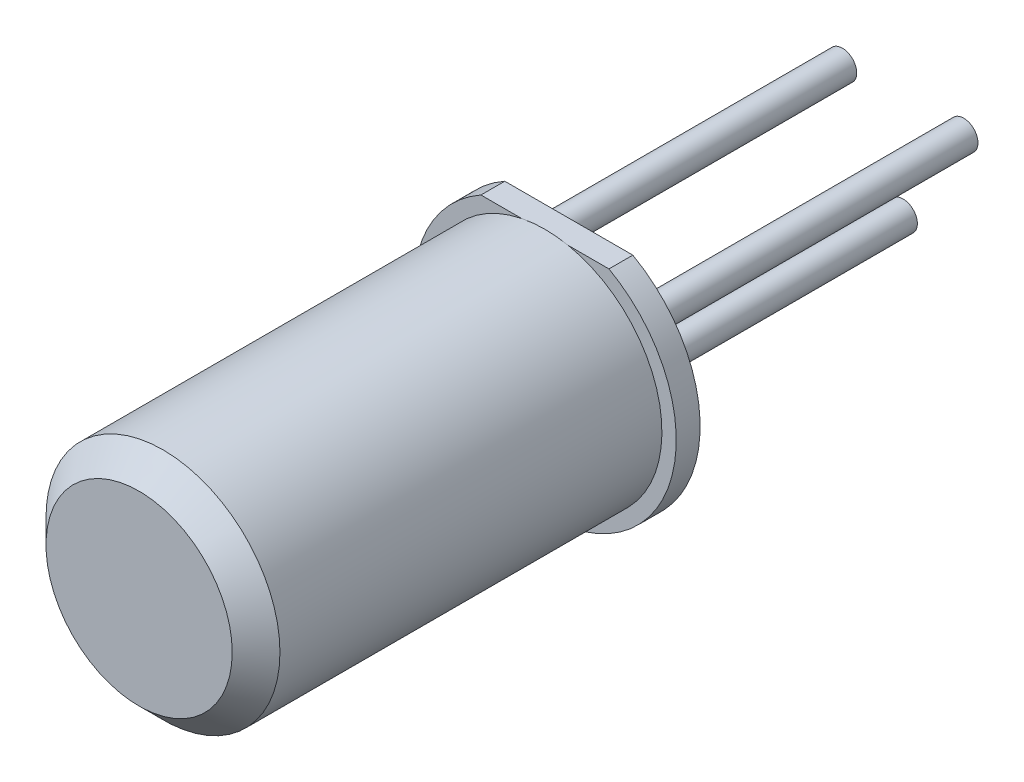
ISO-10303-21;
HEADER;
FILE_DESCRIPTION(('STEP AP214'),'2;1');
FILE_NAME('part.step','',(''),(''),'','','');
FILE_SCHEMA(('AUTOMOTIVE_DESIGN { 1 0 10303 214 1 1 1 1 }'));
ENDSEC;
DATA;
#1=APPLICATION_CONTEXT('core data for automotive mechanical design processes');
#2=APPLICATION_PROTOCOL_DEFINITION('international standard','automotive_design',2000,#1);
#3=PRODUCT_CONTEXT('',#1,'mechanical');
#4=PRODUCT('Part','Part','',(#3));
#5=PRODUCT_RELATED_PRODUCT_CATEGORY('part','',(#4));
#6=PRODUCT_DEFINITION_FORMATION('','',#4);
#7=PRODUCT_DEFINITION_CONTEXT('part definition',#1,'design');
#8=PRODUCT_DEFINITION('design','',#6,#7);
#9=PRODUCT_DEFINITION_SHAPE('','',#8);
#10=(LENGTH_UNIT() NAMED_UNIT(*) SI_UNIT(.MILLI.,.METRE.));
#11=(NAMED_UNIT(*) PLANE_ANGLE_UNIT() SI_UNIT($,.RADIAN.));
#12=(NAMED_UNIT(*) SI_UNIT($,.STERADIAN.) SOLID_ANGLE_UNIT());
#13=UNCERTAINTY_MEASURE_WITH_UNIT(LENGTH_MEASURE(1.E-05),#10,'distance_accuracy_value','');
#14=(GEOMETRIC_REPRESENTATION_CONTEXT(3) GLOBAL_UNCERTAINTY_ASSIGNED_CONTEXT((#13)) GLOBAL_UNIT_ASSIGNED_CONTEXT((#10,
#11,#12)) REPRESENTATION_CONTEXT('',''));
#15=CARTESIAN_POINT('',(0.,0.,0.));
#16=DIRECTION('',(0.,0.,1.));
#17=DIRECTION('',(1.,0.,0.));
#18=AXIS2_PLACEMENT_3D('',#15,#16,#17);
#19=CARTESIAN_POINT('',(0.,0.,7.));
#20=DIRECTION('',(0.,0.,1.));
#21=DIRECTION('',(1.,0.,0.));
#22=AXIS2_PLACEMENT_3D('',#19,#20,#21);
#23=PLANE('',#22);
#24=CARTESIAN_POINT('',(1.27,1.05,7.));
#25=DIRECTION('',(0.,0.,1.));
#26=DIRECTION('',(1.,0.,0.));
#27=AXIS2_PLACEMENT_3D('',#24,#25,#26);
#28=CIRCLE('',#27,0.300000000000004);
#29=CARTESIAN_POINT('',(1.57,1.05,7.));
#30=VERTEX_POINT('',#29);
#31=EDGE_CURVE('E95',#30,#30,#28,.F.);
#32=ORIENTED_EDGE('',*,*,#31,.F.);
#33=EDGE_LOOP('',(#32));
#34=FACE_BOUND('',#33,.T.);
#35=CARTESIAN_POINT('',(0.,0.,7.));
#36=DIRECTION('',(0.,0.,1.));
#37=DIRECTION('',(1.,0.,0.));
#38=AXIS2_PLACEMENT_3D('',#35,#36,#37);
#39=CIRCLE('',#38,2.75);
#40=CARTESIAN_POINT('',(-1.34079252995773,2.40099466713476,7.));
#41=VERTEX_POINT('',#40);
#42=CARTESIAN_POINT('',(1.34079252995773,2.40099466713476,7.));
#43=VERTEX_POINT('',#42);
#44=EDGE_CURVE('E75',#41,#43,#39,.T.);
#45=ORIENTED_EDGE('',*,*,#44,.F.);
#46=DIRECTION('',(-1.,0.,0.));
#47=VECTOR('',#46,1.);
#48=CARTESIAN_POINT('',(-1.34079252995773,2.40099466713476,7.));
#49=LINE('',#48,#47);
#50=EDGE_CURVE('E64',#43,#41,#49,.T.);
#51=ORIENTED_EDGE('',*,*,#50,.F.);
#52=EDGE_LOOP('',(#45,#51));
#53=FACE_BOUND('',#52,.T.);
#54=CARTESIAN_POINT('',(-1.27,1.05,7.));
#55=DIRECTION('',(0.,0.,1.));
#56=DIRECTION('',(1.,0.,0.));
#57=AXIS2_PLACEMENT_3D('',#54,#55,#56);
#58=CIRCLE('',#57,0.300000000000001);
#59=CARTESIAN_POINT('',(-0.969999999999999,1.05,7.));
#60=VERTEX_POINT('',#59);
#61=EDGE_CURVE('E92',#60,#60,#58,.T.);
#62=ORIENTED_EDGE('',*,*,#61,.T.);
#63=EDGE_LOOP('',(#62));
#64=FACE_BOUND('',#63,.T.);
#65=CARTESIAN_POINT('',(0.,-1.05,7.));
#66=DIRECTION('',(0.,0.,1.));
#67=DIRECTION('',(1.,0.,0.));
#68=AXIS2_PLACEMENT_3D('',#65,#66,#67);
#69=CIRCLE('',#68,0.300000000000001);
#70=CARTESIAN_POINT('',(0.300000000000001,-1.05,7.));
#71=VERTEX_POINT('',#70);
#72=EDGE_CURVE('E100',#71,#71,#69,.F.);
#73=ORIENTED_EDGE('',*,*,#72,.F.);
#74=EDGE_LOOP('',(#73));
#75=FACE_BOUND('',#74,.T.);
#76=ADVANCED_FACE('F31',(#34,#53,#64,#75),#23,.F.);
#77=CARTESIAN_POINT('',(-1.27,1.05,7.));
#78=DIRECTION('',(0.,0.,-1.));
#79=DIRECTION('',(-1.,0.,0.));
#80=AXIS2_PLACEMENT_3D('',#77,#78,#79);
#81=CYLINDRICAL_SURFACE('',#80,0.300000000000001);
#82=ORIENTED_EDGE('',*,*,#61,.F.);
#83=EDGE_LOOP('',(#82));
#84=FACE_BOUND('',#83,.T.);
#85=CARTESIAN_POINT('',(-1.27,1.05,0.));
#86=DIRECTION('',(0.,0.,1.));
#87=DIRECTION('',(1.,0.,0.));
#88=AXIS2_PLACEMENT_3D('',#85,#86,#87);
#89=CIRCLE('',#88,0.300000000000001);
#90=CARTESIAN_POINT('',(-0.969999999999999,1.05,0.));
#91=VERTEX_POINT('',#90);
#92=EDGE_CURVE('E91',#91,#91,#89,.T.);
#93=ORIENTED_EDGE('',*,*,#92,.T.);
#94=EDGE_LOOP('',(#93));
#95=FACE_BOUND('',#94,.T.);
#96=ADVANCED_FACE('F136',(#84,#95),#81,.T.);
#97=CARTESIAN_POINT('',(-1.27,1.05,0.));
#98=DIRECTION('',(0.,0.,1.));
#99=DIRECTION('',(1.,0.,0.));
#100=AXIS2_PLACEMENT_3D('',#97,#98,#99);
#101=PLANE('',#100);
#102=ORIENTED_EDGE('',*,*,#92,.F.);
#103=EDGE_LOOP('',(#102));
#104=FACE_BOUND('',#103,.T.);
#105=ADVANCED_FACE('F142',(#104),#101,.F.);
#106=CARTESIAN_POINT('',(0.,0.,7.5));
#107=DIRECTION('',(0.,0.,-1.));
#108=DIRECTION('',(-1.,0.,0.));
#109=AXIS2_PLACEMENT_3D('',#106,#107,#108);
#110=CYLINDRICAL_SURFACE('',#109,2.75);
#111=ORIENTED_EDGE('',*,*,#44,.T.);
#112=DIRECTION('',(0.,0.,-1.));
#113=VECTOR('',#112,1.);
#114=CARTESIAN_POINT('',(1.34079252995773,2.40099466713476,7.5));
#115=LINE('',#114,#113);
#116=CARTESIAN_POINT('',(1.34079252995773,2.40099466713476,7.5));
#117=VERTEX_POINT('',#116);
#118=EDGE_CURVE('E70',#117,#43,#115,.T.);
#119=ORIENTED_EDGE('',*,*,#118,.F.);
#120=CARTESIAN_POINT('',(0.,0.,7.5));
#121=DIRECTION('',(0.,0.,1.));
#122=DIRECTION('',(1.,0.,0.));
#123=AXIS2_PLACEMENT_3D('',#120,#121,#122);
#124=CIRCLE('',#123,2.75);
#125=CARTESIAN_POINT('',(-1.34079252995773,2.40099466713476,7.5));
#126=VERTEX_POINT('',#125);
#127=EDGE_CURVE('E74',#126,#117,#124,.T.);
#128=ORIENTED_EDGE('',*,*,#127,.F.);
#129=DIRECTION('',(0.,0.,-1.));
#130=VECTOR('',#129,1.);
#131=CARTESIAN_POINT('',(-1.34079252995773,2.40099466713476,7.5));
#132=LINE('',#131,#130);
#133=EDGE_CURVE('E67',#126,#41,#132,.T.);
#134=ORIENTED_EDGE('',*,*,#133,.T.);
#135=EDGE_LOOP('',(#111,#119,#128,#134));
#136=FACE_BOUND('',#135,.T.);
#137=ADVANCED_FACE('F78',(#136),#110,.T.);
#138=CARTESIAN_POINT('',(-1.34079252995773,2.40099466713476,7.5));
#139=DIRECTION('',(0.,-1.,0.));
#140=DIRECTION('',(0.,0.,-1.));
#141=AXIS2_PLACEMENT_3D('',#138,#139,#140);
#142=PLANE('',#141);
#143=ORIENTED_EDGE('',*,*,#50,.T.);
#144=ORIENTED_EDGE('',*,*,#133,.F.);
#145=DIRECTION('',(-1.,0.,0.));
#146=VECTOR('',#145,1.);
#147=CARTESIAN_POINT('',(-1.34079252995773,2.40099466713476,7.5));
#148=LINE('',#147,#146);
#149=CARTESIAN_POINT('',(-0.487570106128824,2.40099466713476,7.5));
#150=VERTEX_POINT('',#149);
#151=EDGE_CURVE('E51',#150,#126,#148,.T.);
#152=ORIENTED_EDGE('',*,*,#151,.F.);
#153=CARTESIAN_POINT('',(0.487570106128824,2.40099466713476,7.5));
#154=VERTEX_POINT('',#153);
#155=EDGE_CURVE('E114',#154,#150,#148,.T.);
#156=ORIENTED_EDGE('',*,*,#155,.F.);
#157=EDGE_CURVE('E79',#117,#154,#148,.T.);
#158=ORIENTED_EDGE('',*,*,#157,.F.);
#159=ORIENTED_EDGE('',*,*,#118,.T.);
#160=EDGE_LOOP('',(#143,#144,#152,#156,#158,#159));
#161=FACE_BOUND('',#160,.T.);
#162=ADVANCED_FACE('F66',(#161),#142,.F.);
#163=CARTESIAN_POINT('',(0.,0.,7.5));
#164=DIRECTION('',(0.,0.,1.));
#165=DIRECTION('',(1.,0.,0.));
#166=AXIS2_PLACEMENT_3D('',#163,#164,#165);
#167=PLANE('',#166);
#168=CARTESIAN_POINT('',(0.,0.,7.5));
#169=DIRECTION('',(0.,0.,1.));
#170=DIRECTION('',(1.,0.,0.));
#171=AXIS2_PLACEMENT_3D('',#168,#169,#170);
#172=CIRCLE('',#171,2.45);
#173=EDGE_CURVE('E46',#150,#154,#172,.T.);
#174=ORIENTED_EDGE('',*,*,#173,.F.);
#175=ORIENTED_EDGE('',*,*,#151,.T.);
#176=ORIENTED_EDGE('',*,*,#127,.T.);
#177=ORIENTED_EDGE('',*,*,#157,.T.);
#178=EDGE_LOOP('',(#174,#175,#176,#177));
#179=FACE_BOUND('',#178,.T.);
#180=ADVANCED_FACE('F117',(#179),#167,.T.);
#181=CARTESIAN_POINT('',(1.27,1.05,7.));
#182=DIRECTION('',(0.,0.,-1.));
#183=DIRECTION('',(-1.,0.,0.));
#184=AXIS2_PLACEMENT_3D('',#181,#182,#183);
#185=CYLINDRICAL_SURFACE('',#184,0.300000000000004);
#186=ORIENTED_EDGE('',*,*,#31,.T.);
#187=EDGE_LOOP('',(#186));
#188=FACE_BOUND('',#187,.T.);
#189=CARTESIAN_POINT('',(1.27,1.05,0.));
#190=DIRECTION('',(0.,0.,1.));
#191=DIRECTION('',(1.,0.,0.));
#192=AXIS2_PLACEMENT_3D('',#189,#190,#191);
#193=CIRCLE('',#192,0.300000000000004);
#194=CARTESIAN_POINT('',(1.57,1.05,0.));
#195=VERTEX_POINT('',#194);
#196=EDGE_CURVE('E82',#195,#195,#193,.T.);
#197=ORIENTED_EDGE('',*,*,#196,.T.);
#198=EDGE_LOOP('',(#197));
#199=FACE_BOUND('',#198,.T.);
#200=ADVANCED_FACE('F176',(#188,#199),#185,.T.);
#201=CARTESIAN_POINT('',(1.27,1.05,0.));
#202=DIRECTION('',(0.,0.,1.));
#203=DIRECTION('',(1.,0.,0.));
#204=AXIS2_PLACEMENT_3D('',#201,#202,#203);
#205=PLANE('',#204);
#206=ORIENTED_EDGE('',*,*,#196,.F.);
#207=EDGE_LOOP('',(#206));
#208=FACE_BOUND('',#207,.T.);
#209=ADVANCED_FACE('F181',(#208),#205,.F.);
#210=CARTESIAN_POINT('',(0.,-1.05,7.));
#211=DIRECTION('',(0.,0.,-1.));
#212=DIRECTION('',(-1.,0.,0.));
#213=AXIS2_PLACEMENT_3D('',#210,#211,#212);
#214=CYLINDRICAL_SURFACE('',#213,0.300000000000001);
#215=ORIENTED_EDGE('',*,*,#72,.T.);
#216=EDGE_LOOP('',(#215));
#217=FACE_BOUND('',#216,.T.);
#218=CARTESIAN_POINT('',(0.,-1.05,0.));
#219=DIRECTION('',(0.,0.,1.));
#220=DIRECTION('',(1.,0.,0.));
#221=AXIS2_PLACEMENT_3D('',#218,#219,#220);
#222=CIRCLE('',#221,0.300000000000001);
#223=CARTESIAN_POINT('',(0.300000000000001,-1.05,0.));
#224=VERTEX_POINT('',#223);
#225=EDGE_CURVE('E85',#224,#224,#222,.T.);
#226=ORIENTED_EDGE('',*,*,#225,.T.);
#227=EDGE_LOOP('',(#226));
#228=FACE_BOUND('',#227,.T.);
#229=ADVANCED_FACE('F131',(#217,#228),#214,.T.);
#230=CARTESIAN_POINT('',(0.,-1.05,0.));
#231=DIRECTION('',(0.,0.,1.));
#232=DIRECTION('',(1.,0.,0.));
#233=AXIS2_PLACEMENT_3D('',#230,#231,#232);
#234=PLANE('',#233);
#235=ORIENTED_EDGE('',*,*,#225,.F.);
#236=EDGE_LOOP('',(#235));
#237=FACE_BOUND('',#236,.T.);
#238=ADVANCED_FACE('F122',(#237),#234,.F.);
#239=CARTESIAN_POINT('',(0.,0.,7.5));
#240=DIRECTION('',(0.,0.,1.));
#241=DIRECTION('',(1.,0.,0.));
#242=AXIS2_PLACEMENT_3D('',#239,#240,#241);
#243=PLANE('',#242);
#244=EDGE_CURVE('E106',#154,#150,#172,.T.);
#245=ORIENTED_EDGE('',*,*,#244,.F.);
#246=ORIENTED_EDGE('',*,*,#155,.T.);
#247=EDGE_LOOP('',(#245,#246));
#248=FACE_BOUND('',#247,.T.);
#249=ADVANCED_FACE('F119',(#248),#243,.F.);
#250=CARTESIAN_POINT('',(0.,0.,16.));
#251=DIRECTION('',(0.,0.,-1.));
#252=DIRECTION('',(-1.,0.,0.));
#253=AXIS2_PLACEMENT_3D('',#250,#251,#252);
#254=CYLINDRICAL_SURFACE('',#253,2.45);
#255=CARTESIAN_POINT('',(0.,0.,15.5));
#256=DIRECTION('',(0.,0.,1.));
#257=DIRECTION('',(1.,0.,0.));
#258=AXIS2_PLACEMENT_3D('',#255,#256,#257);
#259=CIRCLE('',#258,2.45);
#260=CARTESIAN_POINT('',(2.45,0.,15.5));
#261=VERTEX_POINT('',#260);
#262=EDGE_CURVE('E11',#261,#261,#259,.F.);
#263=ORIENTED_EDGE('',*,*,#262,.T.);
#264=EDGE_LOOP('',(#263));
#265=FACE_BOUND('',#264,.T.);
#266=ORIENTED_EDGE('',*,*,#244,.T.);
#267=ORIENTED_EDGE('',*,*,#173,.T.);
#268=EDGE_LOOP('',(#266,#267));
#269=FACE_BOUND('',#268,.T.);
#270=ADVANCED_FACE('F121',(#265,#269),#254,.T.);
#271=CARTESIAN_POINT('',(0.,0.,16.));
#272=DIRECTION('',(0.,0.,1.));
#273=DIRECTION('',(1.,0.,0.));
#274=AXIS2_PLACEMENT_3D('',#271,#272,#273);
#275=PLANE('',#274);
#276=CARTESIAN_POINT('',(0.,0.,16.));
#277=DIRECTION('',(0.,0.,1.));
#278=DIRECTION('',(1.,0.,0.));
#279=AXIS2_PLACEMENT_3D('',#276,#277,#278);
#280=CIRCLE('',#279,1.95);
#281=CARTESIAN_POINT('',(1.95,0.,16.));
#282=VERTEX_POINT('',#281);
#283=EDGE_CURVE('E39',#282,#282,#280,.T.);
#284=ORIENTED_EDGE('',*,*,#283,.T.);
#285=EDGE_LOOP('',(#284));
#286=FACE_BOUND('',#285,.T.);
#287=ADVANCED_FACE('F128',(#286),#275,.T.);
#288=CARTESIAN_POINT('',(0.,0.,16.));
#289=DIRECTION('',(0.,0.,-1.));
#290=DIRECTION('',(-1.,0.,0.));
#291=AXIS2_PLACEMENT_3D('',#288,#289,#290);
#292=CONICAL_SURFACE('',#291,1.95,0.785398163397446);
#293=ORIENTED_EDGE('',*,*,#262,.F.);
#294=EDGE_LOOP('',(#293));
#295=FACE_BOUND('',#294,.T.);
#296=ORIENTED_EDGE('',*,*,#283,.F.);
#297=EDGE_LOOP('',(#296));
#298=FACE_BOUND('',#297,.T.);
#299=ADVANCED_FACE('F33',(#295,#298),#292,.T.);
#300=CLOSED_SHELL('',(#76,#96,#105,#137,#162,#180,#200,#209,#229,#238,#249,#270,#287,#299));
#301=MANIFOLD_SOLID_BREP('B2',#300);
#302=ADVANCED_BREP_SHAPE_REPRESENTATION('',(#18,#301),#14);
#303=SHAPE_DEFINITION_REPRESENTATION(#9,#302);
ENDSEC;
END-ISO-10303-21;
